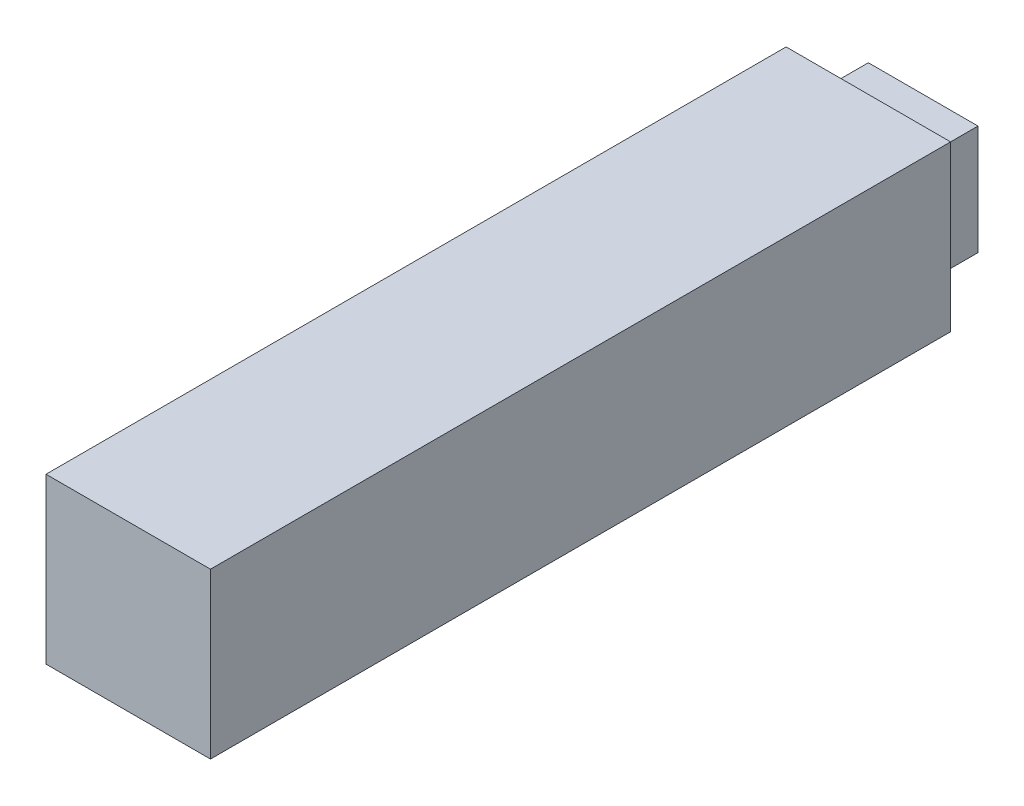
ISO-10303-21;
HEADER;
FILE_DESCRIPTION(('STEP AP214'),'2;1');
FILE_NAME('part.step','',(''),(''),'','','');
FILE_SCHEMA(('AUTOMOTIVE_DESIGN { 1 0 10303 214 1 1 1 1 }'));
ENDSEC;
DATA;
#1=APPLICATION_CONTEXT('core data for automotive mechanical design processes');
#2=APPLICATION_PROTOCOL_DEFINITION('international standard','automotive_design',2000,#1);
#3=PRODUCT_CONTEXT('',#1,'mechanical');
#4=PRODUCT('Part','Part','',(#3));
#5=PRODUCT_RELATED_PRODUCT_CATEGORY('part','',(#4));
#6=PRODUCT_DEFINITION_FORMATION('','',#4);
#7=PRODUCT_DEFINITION_CONTEXT('part definition',#1,'design');
#8=PRODUCT_DEFINITION('design','',#6,#7);
#9=PRODUCT_DEFINITION_SHAPE('','',#8);
#10=(LENGTH_UNIT() NAMED_UNIT(*) SI_UNIT(.MILLI.,.METRE.));
#11=(NAMED_UNIT(*) PLANE_ANGLE_UNIT() SI_UNIT($,.RADIAN.));
#12=(NAMED_UNIT(*) SI_UNIT($,.STERADIAN.) SOLID_ANGLE_UNIT());
#13=UNCERTAINTY_MEASURE_WITH_UNIT(LENGTH_MEASURE(1.E-05),#10,'distance_accuracy_value','');
#14=(GEOMETRIC_REPRESENTATION_CONTEXT(3) GLOBAL_UNCERTAINTY_ASSIGNED_CONTEXT((#13)) GLOBAL_UNIT_ASSIGNED_CONTEXT((#10,
#11,#12)) REPRESENTATION_CONTEXT('',''));
#15=CARTESIAN_POINT('',(0.,0.,0.));
#16=DIRECTION('',(0.,0.,1.));
#17=DIRECTION('',(1.,0.,0.));
#18=AXIS2_PLACEMENT_3D('',#15,#16,#17);
#19=CARTESIAN_POINT('',(0.,0.,0.));
#20=DIRECTION('',(-1.,0.,0.));
#21=DIRECTION('',(0.,0.,1.));
#22=AXIS2_PLACEMENT_3D('',#19,#20,#21);
#23=PLANE('',#22);
#24=DIRECTION('',(0.,-1.,0.));
#25=VECTOR('',#24,1.);
#26=CARTESIAN_POINT('',(0.,10.25,109.75));
#27=LINE('',#26,#25);
#28=CARTESIAN_POINT('',(0.,10.25,109.75));
#29=VERTEX_POINT('',#28);
#30=CARTESIAN_POINT('',(0.,0.,109.75));
#31=VERTEX_POINT('',#30);
#32=EDGE_CURVE('E195',#29,#31,#27,.T.);
#33=ORIENTED_EDGE('',*,*,#32,.T.);
#34=DIRECTION('',(0.,0.,1.));
#35=VECTOR('',#34,1.);
#36=CARTESIAN_POINT('',(0.,0.,0.));
#37=LINE('',#36,#35);
#38=CARTESIAN_POINT('',(0.,0.,130.25));
#39=VERTEX_POINT('',#38);
#40=EDGE_CURVE('E51',#31,#39,#37,.T.);
#41=ORIENTED_EDGE('',*,*,#40,.T.);
#42=DIRECTION('',(0.,1.,0.));
#43=VECTOR('',#42,1.);
#44=CARTESIAN_POINT('',(0.,-10.25,130.25));
#45=LINE('',#44,#43);
#46=CARTESIAN_POINT('',(0.,10.25,130.25));
#47=VERTEX_POINT('',#46);
#48=EDGE_CURVE('E192',#39,#47,#45,.T.);
#49=ORIENTED_EDGE('',*,*,#48,.T.);
#50=DIRECTION('',(0.,0.,-1.));
#51=VECTOR('',#50,1.);
#52=CARTESIAN_POINT('',(0.,10.25,130.25));
#53=LINE('',#52,#51);
#54=EDGE_CURVE('E197',#47,#29,#53,.T.);
#55=ORIENTED_EDGE('',*,*,#54,.T.);
#56=EDGE_LOOP('',(#33,#41,#49,#55));
#57=FACE_BOUND('',#56,.T.);
#58=ADVANCED_FACE('F43',(#57),#23,.T.);
#59=CARTESIAN_POINT('',(0.,0.,0.));
#60=DIRECTION('',(0.,0.,-1.));
#61=DIRECTION('',(-1.,0.,0.));
#62=AXIS2_PLACEMENT_3D('',#59,#60,#61);
#63=PLANE('',#62);
#64=DIRECTION('',(0.,-1.,0.));
#65=VECTOR('',#64,1.);
#66=CARTESIAN_POINT('',(-15.,-15.,0.));
#67=LINE('',#66,#65);
#68=CARTESIAN_POINT('',(-15.,15.,0.));
#69=VERTEX_POINT('',#68);
#70=CARTESIAN_POINT('',(-15.,-15.,0.));
#71=VERTEX_POINT('',#70);
#72=EDGE_CURVE('E248',#69,#71,#67,.T.);
#73=ORIENTED_EDGE('',*,*,#72,.F.);
#74=DIRECTION('',(-1.,0.,0.));
#75=VECTOR('',#74,1.);
#76=CARTESIAN_POINT('',(-15.,15.,0.));
#77=LINE('',#76,#75);
#78=CARTESIAN_POINT('',(15.,15.,0.));
#79=VERTEX_POINT('',#78);
#80=EDGE_CURVE('E258',#79,#69,#77,.T.);
#81=ORIENTED_EDGE('',*,*,#80,.F.);
#82=DIRECTION('',(0.,1.,0.));
#83=VECTOR('',#82,1.);
#84=CARTESIAN_POINT('',(15.,-15.,0.));
#85=LINE('',#84,#83);
#86=CARTESIAN_POINT('',(15.,-15.,0.));
#87=VERTEX_POINT('',#86);
#88=EDGE_CURVE('E270',#87,#79,#85,.T.);
#89=ORIENTED_EDGE('',*,*,#88,.F.);
#90=DIRECTION('',(1.,0.,0.));
#91=VECTOR('',#90,1.);
#92=CARTESIAN_POINT('',(-15.,-15.,0.));
#93=LINE('',#92,#91);
#94=EDGE_CURVE('E264',#71,#87,#93,.T.);
#95=ORIENTED_EDGE('',*,*,#94,.F.);
#96=EDGE_LOOP('',(#73,#81,#89,#95));
#97=FACE_BOUND('',#96,.T.);
#98=DIRECTION('',(-1.,0.,0.));
#99=VECTOR('',#98,1.);
#100=CARTESIAN_POINT('',(-10.,10.,0.));
#101=LINE('',#100,#99);
#102=CARTESIAN_POINT('',(10.,10.,0.));
#103=VERTEX_POINT('',#102);
#104=CARTESIAN_POINT('',(-10.,10.,0.));
#105=VERTEX_POINT('',#104);
#106=EDGE_CURVE('E224',#103,#105,#101,.T.);
#107=ORIENTED_EDGE('',*,*,#106,.T.);
#108=DIRECTION('',(0.,-1.,0.));
#109=VECTOR('',#108,1.);
#110=CARTESIAN_POINT('',(-10.,-10.,0.));
#111=LINE('',#110,#109);
#112=CARTESIAN_POINT('',(-10.,-10.,0.));
#113=VERTEX_POINT('',#112);
#114=EDGE_CURVE('E213',#105,#113,#111,.T.);
#115=ORIENTED_EDGE('',*,*,#114,.T.);
#116=DIRECTION('',(1.,0.,0.));
#117=VECTOR('',#116,1.);
#118=CARTESIAN_POINT('',(-10.,-10.,0.));
#119=LINE('',#118,#117);
#120=CARTESIAN_POINT('',(10.,-10.,0.));
#121=VERTEX_POINT('',#120);
#122=EDGE_CURVE('E234',#113,#121,#119,.T.);
#123=ORIENTED_EDGE('',*,*,#122,.T.);
#124=DIRECTION('',(0.,1.,0.));
#125=VECTOR('',#124,1.);
#126=CARTESIAN_POINT('',(10.,-10.,0.));
#127=LINE('',#126,#125);
#128=EDGE_CURVE('E236',#121,#103,#127,.T.);
#129=ORIENTED_EDGE('',*,*,#128,.T.);
#130=EDGE_LOOP('',(#107,#115,#123,#129));
#131=FACE_BOUND('',#130,.T.);
#132=ADVANCED_FACE('F314',(#97,#131),#63,.T.);
#133=CARTESIAN_POINT('',(-15.,-15.,135.));
#134=DIRECTION('',(1.,0.,0.));
#135=DIRECTION('',(0.,0.,-1.));
#136=AXIS2_PLACEMENT_3D('',#133,#134,#135);
#137=PLANE('',#136);
#138=DIRECTION('',(0.,0.,1.));
#139=VECTOR('',#138,1.);
#140=CARTESIAN_POINT('',(-15.,-10.25,109.75));
#141=LINE('',#140,#139);
#142=CARTESIAN_POINT('',(-15.,-10.25,109.75));
#143=VERTEX_POINT('',#142);
#144=CARTESIAN_POINT('',(-15.,-10.25,130.25));
#145=VERTEX_POINT('',#144);
#146=EDGE_CURVE('E201',#143,#145,#141,.T.);
#147=ORIENTED_EDGE('',*,*,#146,.F.);
#148=DIRECTION('',(0.,-1.,0.));
#149=VECTOR('',#148,1.);
#150=CARTESIAN_POINT('',(-15.,10.25,109.75));
#151=LINE('',#150,#149);
#152=CARTESIAN_POINT('',(-15.,10.25,109.75));
#153=VERTEX_POINT('',#152);
#154=EDGE_CURVE('E186',#153,#143,#151,.T.);
#155=ORIENTED_EDGE('',*,*,#154,.F.);
#156=DIRECTION('',(0.,0.,-1.));
#157=VECTOR('',#156,1.);
#158=CARTESIAN_POINT('',(-15.,10.25,130.25));
#159=LINE('',#158,#157);
#160=CARTESIAN_POINT('',(-15.,10.25,130.25));
#161=VERTEX_POINT('',#160);
#162=EDGE_CURVE('E194',#161,#153,#159,.T.);
#163=ORIENTED_EDGE('',*,*,#162,.F.);
#164=DIRECTION('',(0.,1.,0.));
#165=VECTOR('',#164,1.);
#166=CARTESIAN_POINT('',(-15.,-10.25,130.25));
#167=LINE('',#166,#165);
#168=EDGE_CURVE('E206',#145,#161,#167,.T.);
#169=ORIENTED_EDGE('',*,*,#168,.F.);
#170=EDGE_LOOP('',(#147,#155,#163,#169));
#171=FACE_BOUND('',#170,.T.);
#172=ORIENTED_EDGE('',*,*,#72,.T.);
#173=DIRECTION('',(0.,0.,-1.));
#174=VECTOR('',#173,1.);
#175=CARTESIAN_POINT('',(-15.,-15.,135.));
#176=LINE('',#175,#174);
#177=CARTESIAN_POINT('',(-15.,-15.,135.));
#178=VERTEX_POINT('',#177);
#179=EDGE_CURVE('E279',#178,#71,#176,.T.);
#180=ORIENTED_EDGE('',*,*,#179,.F.);
#181=DIRECTION('',(0.,-1.,0.));
#182=VECTOR('',#181,1.);
#183=CARTESIAN_POINT('',(-15.,-15.,135.));
#184=LINE('',#183,#182);
#185=CARTESIAN_POINT('',(-15.,15.,135.));
#186=VERTEX_POINT('',#185);
#187=EDGE_CURVE('E252',#186,#178,#184,.T.);
#188=ORIENTED_EDGE('',*,*,#187,.F.);
#189=DIRECTION('',(0.,0.,-1.));
#190=VECTOR('',#189,1.);
#191=CARTESIAN_POINT('',(-15.,15.,135.));
#192=LINE('',#191,#190);
#193=EDGE_CURVE('E265',#186,#69,#192,.T.);
#194=ORIENTED_EDGE('',*,*,#193,.T.);
#195=EDGE_LOOP('',(#172,#180,#188,#194));
#196=FACE_BOUND('',#195,.T.);
#197=ADVANCED_FACE('F44',(#171,#196),#137,.F.);
#198=CARTESIAN_POINT('',(-15.,-15.,135.));
#199=DIRECTION('',(0.,1.,0.));
#200=DIRECTION('',(0.,0.,1.));
#201=AXIS2_PLACEMENT_3D('',#198,#199,#200);
#202=PLANE('',#201);
#203=DIRECTION('',(1.,0.,0.));
#204=VECTOR('',#203,1.);
#205=CARTESIAN_POINT('',(-10.25,-15.,109.75));
#206=LINE('',#205,#204);
#207=CARTESIAN_POINT('',(-10.25,-15.,109.75));
#208=VERTEX_POINT('',#207);
#209=CARTESIAN_POINT('',(10.25,-15.,109.75));
#210=VERTEX_POINT('',#209);
#211=EDGE_CURVE('E168',#208,#210,#206,.T.);
#212=ORIENTED_EDGE('',*,*,#211,.F.);
#213=DIRECTION('',(0.,0.,-1.));
#214=VECTOR('',#213,1.);
#215=CARTESIAN_POINT('',(-10.25,-15.,130.25));
#216=LINE('',#215,#214);
#217=CARTESIAN_POINT('',(-10.25,-15.,130.25));
#218=VERTEX_POINT('',#217);
#219=EDGE_CURVE('E59',#218,#208,#216,.T.);
#220=ORIENTED_EDGE('',*,*,#219,.F.);
#221=DIRECTION('',(-1.,0.,0.));
#222=VECTOR('',#221,1.);
#223=CARTESIAN_POINT('',(10.25,-15.,130.25));
#224=LINE('',#223,#222);
#225=CARTESIAN_POINT('',(10.25,-15.,130.25));
#226=VERTEX_POINT('',#225);
#227=EDGE_CURVE('E162',#226,#218,#224,.T.);
#228=ORIENTED_EDGE('',*,*,#227,.F.);
#229=DIRECTION('',(0.,0.,1.));
#230=VECTOR('',#229,1.);
#231=CARTESIAN_POINT('',(10.25,-15.,109.75));
#232=LINE('',#231,#230);
#233=EDGE_CURVE('E181',#210,#226,#232,.T.);
#234=ORIENTED_EDGE('',*,*,#233,.F.);
#235=EDGE_LOOP('',(#212,#220,#228,#234));
#236=FACE_BOUND('',#235,.T.);
#237=ORIENTED_EDGE('',*,*,#94,.T.);
#238=DIRECTION('',(0.,0.,-1.));
#239=VECTOR('',#238,1.);
#240=CARTESIAN_POINT('',(15.,-15.,135.));
#241=LINE('',#240,#239);
#242=CARTESIAN_POINT('',(15.,-15.,135.));
#243=VERTEX_POINT('',#242);
#244=EDGE_CURVE('E274',#243,#87,#241,.T.);
#245=ORIENTED_EDGE('',*,*,#244,.F.);
#246=DIRECTION('',(1.,0.,0.));
#247=VECTOR('',#246,1.);
#248=CARTESIAN_POINT('',(-15.,-15.,135.));
#249=LINE('',#248,#247);
#250=EDGE_CURVE('E254',#178,#243,#249,.T.);
#251=ORIENTED_EDGE('',*,*,#250,.F.);
#252=ORIENTED_EDGE('',*,*,#179,.T.);
#253=EDGE_LOOP('',(#237,#245,#251,#252));
#254=FACE_BOUND('',#253,.T.);
#255=ADVANCED_FACE('F303',(#236,#254),#202,.F.);
#256=CARTESIAN_POINT('',(15.,-15.,135.));
#257=DIRECTION('',(-1.,0.,0.));
#258=DIRECTION('',(0.,0.,1.));
#259=AXIS2_PLACEMENT_3D('',#256,#257,#258);
#260=PLANE('',#259);
#261=ORIENTED_EDGE('',*,*,#88,.T.);
#262=DIRECTION('',(0.,0.,-1.));
#263=VECTOR('',#262,1.);
#264=CARTESIAN_POINT('',(15.,15.,135.));
#265=LINE('',#264,#263);
#266=CARTESIAN_POINT('',(15.,15.,135.));
#267=VERTEX_POINT('',#266);
#268=EDGE_CURVE('E275',#267,#79,#265,.T.);
#269=ORIENTED_EDGE('',*,*,#268,.F.);
#270=DIRECTION('',(0.,1.,0.));
#271=VECTOR('',#270,1.);
#272=CARTESIAN_POINT('',(15.,-15.,135.));
#273=LINE('',#272,#271);
#274=EDGE_CURVE('E256',#243,#267,#273,.T.);
#275=ORIENTED_EDGE('',*,*,#274,.F.);
#276=ORIENTED_EDGE('',*,*,#244,.T.);
#277=EDGE_LOOP('',(#261,#269,#275,#276));
#278=FACE_BOUND('',#277,.T.);
#279=ADVANCED_FACE('F302',(#278),#260,.F.);
#280=CARTESIAN_POINT('',(-15.,15.,135.));
#281=DIRECTION('',(0.,-1.,0.));
#282=DIRECTION('',(0.,0.,-1.));
#283=AXIS2_PLACEMENT_3D('',#280,#281,#282);
#284=PLANE('',#283);
#285=ORIENTED_EDGE('',*,*,#80,.T.);
#286=ORIENTED_EDGE('',*,*,#193,.F.);
#287=DIRECTION('',(-1.,0.,0.));
#288=VECTOR('',#287,1.);
#289=CARTESIAN_POINT('',(-15.,15.,135.));
#290=LINE('',#289,#288);
#291=EDGE_CURVE('E257',#267,#186,#290,.T.);
#292=ORIENTED_EDGE('',*,*,#291,.F.);
#293=ORIENTED_EDGE('',*,*,#268,.T.);
#294=EDGE_LOOP('',(#285,#286,#292,#293));
#295=FACE_BOUND('',#294,.T.);
#296=ADVANCED_FACE('F318',(#295),#284,.F.);
#297=CARTESIAN_POINT('',(0.,0.,135.));
#298=DIRECTION('',(0.,0.,-1.));
#299=DIRECTION('',(-1.,0.,0.));
#300=AXIS2_PLACEMENT_3D('',#297,#298,#299);
#301=PLANE('',#300);
#302=ORIENTED_EDGE('',*,*,#187,.T.);
#303=ORIENTED_EDGE('',*,*,#250,.T.);
#304=ORIENTED_EDGE('',*,*,#274,.T.);
#305=ORIENTED_EDGE('',*,*,#291,.T.);
#306=EDGE_LOOP('',(#302,#303,#304,#305));
#307=FACE_BOUND('',#306,.T.);
#308=ADVANCED_FACE('F325',(#307),#301,.F.);
#309=CARTESIAN_POINT('',(-10.,-10.,-10.));
#310=DIRECTION('',(-1.,0.,0.));
#311=DIRECTION('',(0.,0.,1.));
#312=AXIS2_PLACEMENT_3D('',#309,#310,#311);
#313=PLANE('',#312);
#314=ORIENTED_EDGE('',*,*,#114,.F.);
#315=DIRECTION('',(0.,0.,1.));
#316=VECTOR('',#315,1.);
#317=CARTESIAN_POINT('',(-10.,10.,-10.));
#318=LINE('',#317,#316);
#319=CARTESIAN_POINT('',(-10.,10.,-10.));
#320=VERTEX_POINT('',#319);
#321=EDGE_CURVE('E244',#320,#105,#318,.T.);
#322=ORIENTED_EDGE('',*,*,#321,.F.);
#323=DIRECTION('',(0.,-1.,0.));
#324=VECTOR('',#323,1.);
#325=CARTESIAN_POINT('',(-10.,-10.,-10.));
#326=LINE('',#325,#324);
#327=CARTESIAN_POINT('',(-10.,-10.,-10.));
#328=VERTEX_POINT('',#327);
#329=EDGE_CURVE('E218',#320,#328,#326,.T.);
#330=ORIENTED_EDGE('',*,*,#329,.T.);
#331=DIRECTION('',(0.,0.,1.));
#332=VECTOR('',#331,1.);
#333=CARTESIAN_POINT('',(-10.,-10.,-10.));
#334=LINE('',#333,#332);
#335=EDGE_CURVE('E235',#328,#113,#334,.T.);
#336=ORIENTED_EDGE('',*,*,#335,.T.);
#337=EDGE_LOOP('',(#314,#322,#330,#336));
#338=FACE_BOUND('',#337,.T.);
#339=ADVANCED_FACE('F322',(#338),#313,.T.);
#340=CARTESIAN_POINT('',(-10.,10.,-10.));
#341=DIRECTION('',(0.,1.,0.));
#342=DIRECTION('',(0.,0.,1.));
#343=AXIS2_PLACEMENT_3D('',#340,#341,#342);
#344=PLANE('',#343);
#345=ORIENTED_EDGE('',*,*,#106,.F.);
#346=DIRECTION('',(0.,0.,1.));
#347=VECTOR('',#346,1.);
#348=CARTESIAN_POINT('',(10.,10.,-10.));
#349=LINE('',#348,#347);
#350=CARTESIAN_POINT('',(10.,10.,-10.));
#351=VERTEX_POINT('',#350);
#352=EDGE_CURVE('E250',#351,#103,#349,.T.);
#353=ORIENTED_EDGE('',*,*,#352,.F.);
#354=DIRECTION('',(-1.,0.,0.));
#355=VECTOR('',#354,1.);
#356=CARTESIAN_POINT('',(-10.,10.,-10.));
#357=LINE('',#356,#355);
#358=EDGE_CURVE('E226',#351,#320,#357,.T.);
#359=ORIENTED_EDGE('',*,*,#358,.T.);
#360=ORIENTED_EDGE('',*,*,#321,.T.);
#361=EDGE_LOOP('',(#345,#353,#359,#360));
#362=FACE_BOUND('',#361,.T.);
#363=ADVANCED_FACE('F332',(#362),#344,.T.);
#364=CARTESIAN_POINT('',(10.,-10.,-10.));
#365=DIRECTION('',(1.,0.,0.));
#366=DIRECTION('',(0.,0.,-1.));
#367=AXIS2_PLACEMENT_3D('',#364,#365,#366);
#368=PLANE('',#367);
#369=ORIENTED_EDGE('',*,*,#128,.F.);
#370=DIRECTION('',(0.,0.,1.));
#371=VECTOR('',#370,1.);
#372=CARTESIAN_POINT('',(10.,-10.,-10.));
#373=LINE('',#372,#371);
#374=CARTESIAN_POINT('',(10.,-10.,-10.));
#375=VERTEX_POINT('',#374);
#376=EDGE_CURVE('E247',#375,#121,#373,.T.);
#377=ORIENTED_EDGE('',*,*,#376,.F.);
#378=DIRECTION('',(0.,1.,0.));
#379=VECTOR('',#378,1.);
#380=CARTESIAN_POINT('',(10.,-10.,-10.));
#381=LINE('',#380,#379);
#382=EDGE_CURVE('E227',#375,#351,#381,.T.);
#383=ORIENTED_EDGE('',*,*,#382,.T.);
#384=ORIENTED_EDGE('',*,*,#352,.T.);
#385=EDGE_LOOP('',(#369,#377,#383,#384));
#386=FACE_BOUND('',#385,.T.);
#387=ADVANCED_FACE('F356',(#386),#368,.T.);
#388=CARTESIAN_POINT('',(-10.,-10.,-10.));
#389=DIRECTION('',(0.,-1.,0.));
#390=DIRECTION('',(0.,0.,-1.));
#391=AXIS2_PLACEMENT_3D('',#388,#389,#390);
#392=PLANE('',#391);
#393=ORIENTED_EDGE('',*,*,#122,.F.);
#394=ORIENTED_EDGE('',*,*,#335,.F.);
#395=DIRECTION('',(1.,0.,0.));
#396=VECTOR('',#395,1.);
#397=CARTESIAN_POINT('',(-10.,-10.,-10.));
#398=LINE('',#397,#396);
#399=EDGE_CURVE('E225',#328,#375,#398,.T.);
#400=ORIENTED_EDGE('',*,*,#399,.T.);
#401=ORIENTED_EDGE('',*,*,#376,.T.);
#402=EDGE_LOOP('',(#393,#394,#400,#401));
#403=FACE_BOUND('',#402,.T.);
#404=ADVANCED_FACE('F351',(#403),#392,.T.);
#405=CARTESIAN_POINT('',(0.,0.,-10.));
#406=DIRECTION('',(0.,0.,-1.));
#407=DIRECTION('',(-1.,0.,0.));
#408=AXIS2_PLACEMENT_3D('',#405,#406,#407);
#409=PLANE('',#408);
#410=ORIENTED_EDGE('',*,*,#329,.F.);
#411=ORIENTED_EDGE('',*,*,#358,.F.);
#412=ORIENTED_EDGE('',*,*,#382,.F.);
#413=ORIENTED_EDGE('',*,*,#399,.F.);
#414=EDGE_LOOP('',(#410,#411,#412,#413));
#415=FACE_BOUND('',#414,.T.);
#416=ADVANCED_FACE('F352',(#415),#409,.T.);
#417=CARTESIAN_POINT('',(0.,10.25,109.75));
#418=DIRECTION('',(0.,0.,-1.));
#419=DIRECTION('',(-1.,0.,0.));
#420=AXIS2_PLACEMENT_3D('',#417,#418,#419);
#421=PLANE('',#420);
#422=DIRECTION('',(-1.,0.,0.));
#423=VECTOR('',#422,1.);
#424=CARTESIAN_POINT('',(0.,-10.25,109.75));
#425=LINE('',#424,#423);
#426=CARTESIAN_POINT('',(-10.25,-10.25,109.75));
#427=VERTEX_POINT('',#426);
#428=EDGE_CURVE('E199',#427,#143,#425,.T.);
#429=ORIENTED_EDGE('',*,*,#428,.F.);
#430=DIRECTION('',(0.,-1.,0.));
#431=VECTOR('',#430,1.);
#432=CARTESIAN_POINT('',(-10.25,0.,109.75));
#433=LINE('',#432,#431);
#434=EDGE_CURVE('E173',#427,#208,#433,.T.);
#435=ORIENTED_EDGE('',*,*,#434,.T.);
#436=ORIENTED_EDGE('',*,*,#211,.T.);
#437=DIRECTION('',(0.,-1.,0.));
#438=VECTOR('',#437,1.);
#439=CARTESIAN_POINT('',(10.25,0.,109.75));
#440=LINE('',#439,#438);
#441=CARTESIAN_POINT('',(10.25,0.,109.75));
#442=VERTEX_POINT('',#441);
#443=EDGE_CURVE('E167',#442,#210,#440,.T.);
#444=ORIENTED_EDGE('',*,*,#443,.F.);
#445=DIRECTION('',(1.,0.,0.));
#446=VECTOR('',#445,1.);
#447=CARTESIAN_POINT('',(-10.25,0.,109.75));
#448=LINE('',#447,#446);
#449=EDGE_CURVE('E154',#31,#442,#448,.T.);
#450=ORIENTED_EDGE('',*,*,#449,.F.);
#451=ORIENTED_EDGE('',*,*,#32,.F.);
#452=DIRECTION('',(-1.,0.,0.));
#453=VECTOR('',#452,1.);
#454=CARTESIAN_POINT('',(0.,10.25,109.75));
#455=LINE('',#454,#453);
#456=EDGE_CURVE('E211',#29,#153,#455,.T.);
#457=ORIENTED_EDGE('',*,*,#456,.T.);
#458=ORIENTED_EDGE('',*,*,#154,.T.);
#459=EDGE_LOOP('',(#429,#435,#436,#444,#450,#451,#457,#458));
#460=FACE_BOUND('',#459,.T.);
#461=ADVANCED_FACE('F169',(#460),#421,.F.);
#462=CARTESIAN_POINT('',(0.,10.25,130.25));
#463=DIRECTION('',(0.,1.,0.));
#464=DIRECTION('',(0.,0.,1.));
#465=AXIS2_PLACEMENT_3D('',#462,#463,#464);
#466=PLANE('',#465);
#467=ORIENTED_EDGE('',*,*,#162,.T.);
#468=ORIENTED_EDGE('',*,*,#456,.F.);
#469=ORIENTED_EDGE('',*,*,#54,.F.);
#470=DIRECTION('',(-1.,0.,0.));
#471=VECTOR('',#470,1.);
#472=CARTESIAN_POINT('',(0.,10.25,130.25));
#473=LINE('',#472,#471);
#474=EDGE_CURVE('E212',#47,#161,#473,.T.);
#475=ORIENTED_EDGE('',*,*,#474,.T.);
#476=EDGE_LOOP('',(#467,#468,#469,#475));
#477=FACE_BOUND('',#476,.T.);
#478=ADVANCED_FACE('F287',(#477),#466,.F.);
#479=CARTESIAN_POINT('',(0.,-10.25,130.25));
#480=DIRECTION('',(0.,0.,1.));
#481=DIRECTION('',(1.,0.,0.));
#482=AXIS2_PLACEMENT_3D('',#479,#480,#481);
#483=PLANE('',#482);
#484=ORIENTED_EDGE('',*,*,#48,.F.);
#485=DIRECTION('',(-1.,0.,0.));
#486=VECTOR('',#485,1.);
#487=CARTESIAN_POINT('',(10.25,0.,130.25));
#488=LINE('',#487,#486);
#489=CARTESIAN_POINT('',(10.25,0.,130.25));
#490=VERTEX_POINT('',#489);
#491=EDGE_CURVE('E68',#490,#39,#488,.T.);
#492=ORIENTED_EDGE('',*,*,#491,.F.);
#493=DIRECTION('',(0.,-1.,0.));
#494=VECTOR('',#493,1.);
#495=CARTESIAN_POINT('',(10.25,0.,130.25));
#496=LINE('',#495,#494);
#497=EDGE_CURVE('E171',#490,#226,#496,.T.);
#498=ORIENTED_EDGE('',*,*,#497,.T.);
#499=ORIENTED_EDGE('',*,*,#227,.T.);
#500=DIRECTION('',(0.,-1.,0.));
#501=VECTOR('',#500,1.);
#502=CARTESIAN_POINT('',(-10.25,0.,130.25));
#503=LINE('',#502,#501);
#504=CARTESIAN_POINT('',(-10.25,-10.25,130.25));
#505=VERTEX_POINT('',#504);
#506=EDGE_CURVE('E190',#505,#218,#503,.T.);
#507=ORIENTED_EDGE('',*,*,#506,.F.);
#508=DIRECTION('',(-1.,0.,0.));
#509=VECTOR('',#508,1.);
#510=CARTESIAN_POINT('',(0.,-10.25,130.25));
#511=LINE('',#510,#509);
#512=EDGE_CURVE('E216',#505,#145,#511,.T.);
#513=ORIENTED_EDGE('',*,*,#512,.T.);
#514=ORIENTED_EDGE('',*,*,#168,.T.);
#515=ORIENTED_EDGE('',*,*,#474,.F.);
#516=EDGE_LOOP('',(#484,#492,#498,#499,#507,#513,#514,#515));
#517=FACE_BOUND('',#516,.T.);
#518=ADVANCED_FACE('F281',(#517),#483,.F.);
#519=CARTESIAN_POINT('',(0.,-10.25,109.75));
#520=DIRECTION('',(0.,-1.,0.));
#521=DIRECTION('',(0.,0.,-1.));
#522=AXIS2_PLACEMENT_3D('',#519,#520,#521);
#523=PLANE('',#522);
#524=ORIENTED_EDGE('',*,*,#512,.F.);
#525=DIRECTION('',(0.,0.,-1.));
#526=VECTOR('',#525,1.);
#527=CARTESIAN_POINT('',(-10.25,-10.25,109.75));
#528=LINE('',#527,#526);
#529=EDGE_CURVE('E11',#505,#427,#528,.T.);
#530=ORIENTED_EDGE('',*,*,#529,.T.);
#531=ORIENTED_EDGE('',*,*,#428,.T.);
#532=ORIENTED_EDGE('',*,*,#146,.T.);
#533=EDGE_LOOP('',(#524,#530,#531,#532));
#534=FACE_BOUND('',#533,.T.);
#535=ADVANCED_FACE('F297',(#534),#523,.F.);
#536=CARTESIAN_POINT('',(-10.25,0.,130.25));
#537=DIRECTION('',(-1.,0.,0.));
#538=DIRECTION('',(0.,0.,1.));
#539=AXIS2_PLACEMENT_3D('',#536,#537,#538);
#540=PLANE('',#539);
#541=ORIENTED_EDGE('',*,*,#506,.T.);
#542=ORIENTED_EDGE('',*,*,#219,.T.);
#543=ORIENTED_EDGE('',*,*,#434,.F.);
#544=ORIENTED_EDGE('',*,*,#529,.F.);
#545=EDGE_LOOP('',(#541,#542,#543,#544));
#546=FACE_BOUND('',#545,.T.);
#547=ADVANCED_FACE('F299',(#546),#540,.F.);
#548=CARTESIAN_POINT('',(10.25,0.,109.75));
#549=DIRECTION('',(1.,0.,0.));
#550=DIRECTION('',(0.,0.,-1.));
#551=AXIS2_PLACEMENT_3D('',#548,#549,#550);
#552=PLANE('',#551);
#553=ORIENTED_EDGE('',*,*,#233,.T.);
#554=ORIENTED_EDGE('',*,*,#497,.F.);
#555=DIRECTION('',(0.,0.,1.));
#556=VECTOR('',#555,1.);
#557=CARTESIAN_POINT('',(10.25,0.,109.75));
#558=LINE('',#557,#556);
#559=EDGE_CURVE('E157',#442,#490,#558,.T.);
#560=ORIENTED_EDGE('',*,*,#559,.F.);
#561=ORIENTED_EDGE('',*,*,#443,.T.);
#562=EDGE_LOOP('',(#553,#554,#560,#561));
#563=FACE_BOUND('',#562,.T.);
#564=ADVANCED_FACE('F180',(#563),#552,.F.);
#565=CARTESIAN_POINT('',(0.,0.,0.));
#566=DIRECTION('',(0.,-1.,0.));
#567=DIRECTION('',(0.,0.,-1.));
#568=AXIS2_PLACEMENT_3D('',#565,#566,#567);
#569=PLANE('',#568);
#570=ORIENTED_EDGE('',*,*,#449,.T.);
#571=ORIENTED_EDGE('',*,*,#559,.T.);
#572=ORIENTED_EDGE('',*,*,#491,.T.);
#573=ORIENTED_EDGE('',*,*,#40,.F.);
#574=EDGE_LOOP('',(#570,#571,#572,#573));
#575=FACE_BOUND('',#574,.T.);
#576=ADVANCED_FACE('F160',(#575),#569,.T.);
#577=CLOSED_SHELL('',(#58,#132,#197,#255,#279,#296,#308,#339,#363,#387,#404,#416,#461,#478,#518,
#535,#547,#564,#576));
#578=MANIFOLD_SOLID_BREP('B2',#577);
#579=ADVANCED_BREP_SHAPE_REPRESENTATION('',(#18,#578),#14);
#580=SHAPE_DEFINITION_REPRESENTATION(#9,#579);
ENDSEC;
END-ISO-10303-21;
